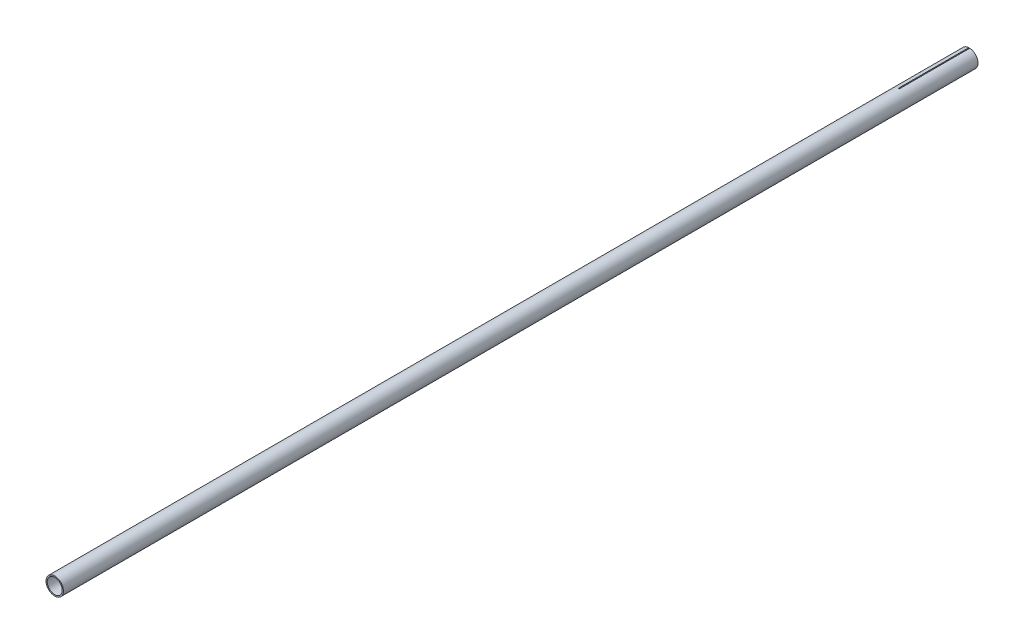
ISO-10303-21;
HEADER;
FILE_DESCRIPTION(('STEP AP214'),'2;1');
FILE_NAME('part.step','',(''),(''),'','','');
FILE_SCHEMA(('AUTOMOTIVE_DESIGN { 1 0 10303 214 1 1 1 1 }'));
ENDSEC;
DATA;
#1=APPLICATION_CONTEXT('core data for automotive mechanical design processes');
#2=APPLICATION_PROTOCOL_DEFINITION('international standard','automotive_design',2000,#1);
#3=PRODUCT_CONTEXT('',#1,'mechanical');
#4=PRODUCT('Part','Part','',(#3));
#5=PRODUCT_RELATED_PRODUCT_CATEGORY('part','',(#4));
#6=PRODUCT_DEFINITION_FORMATION('','',#4);
#7=PRODUCT_DEFINITION_CONTEXT('part definition',#1,'design');
#8=PRODUCT_DEFINITION('design','',#6,#7);
#9=PRODUCT_DEFINITION_SHAPE('','',#8);
#10=(LENGTH_UNIT() NAMED_UNIT(*) SI_UNIT(.MILLI.,.METRE.));
#11=(NAMED_UNIT(*) PLANE_ANGLE_UNIT() SI_UNIT($,.RADIAN.));
#12=(NAMED_UNIT(*) SI_UNIT($,.STERADIAN.) SOLID_ANGLE_UNIT());
#13=UNCERTAINTY_MEASURE_WITH_UNIT(LENGTH_MEASURE(1.E-05),#10,'distance_accuracy_value','');
#14=(GEOMETRIC_REPRESENTATION_CONTEXT(3) GLOBAL_UNCERTAINTY_ASSIGNED_CONTEXT((#13)) GLOBAL_UNIT_ASSIGNED_CONTEXT((#10,
#11,#12)) REPRESENTATION_CONTEXT('',''));
#15=CARTESIAN_POINT('',(0.,0.,0.));
#16=DIRECTION('',(0.,0.,1.));
#17=DIRECTION('',(1.,0.,0.));
#18=AXIS2_PLACEMENT_3D('',#15,#16,#17);
#19=CARTESIAN_POINT('',(0.,0.,0.));
#20=DIRECTION('',(0.,0.,1.));
#21=DIRECTION('',(1.,0.,0.));
#22=AXIS2_PLACEMENT_3D('',#19,#20,#21);
#23=PLANE('',#22);
#24=DIRECTION('',(0.,-1.,0.));
#25=VECTOR('',#24,1.);
#26=CARTESIAN_POINT('',(-1.04,-25.,0.));
#27=LINE('',#26,#25);
#28=CARTESIAN_POINT('',(-1.04,-14.9639032341164,0.));
#29=VERTEX_POINT('',#28);
#30=CARTESIAN_POINT('',(-1.04,-17.4289988237994,0.));
#31=VERTEX_POINT('',#30);
#32=EDGE_CURVE('E120',#29,#31,#27,.T.);
#33=ORIENTED_EDGE('',*,*,#32,.T.);
#34=CARTESIAN_POINT('',(0.,0.,0.));
#35=DIRECTION('',(0.,0.,1.));
#36=DIRECTION('',(1.,0.,0.));
#37=AXIS2_PLACEMENT_3D('',#34,#35,#36);
#38=CIRCLE('',#37,17.46);
#39=CARTESIAN_POINT('',(-1.04,17.4289988237994,0.));
#40=VERTEX_POINT('',#39);
#41=EDGE_CURVE('E126',#40,#31,#38,.T.);
#42=ORIENTED_EDGE('',*,*,#41,.F.);
#43=CARTESIAN_POINT('',(-1.04,14.9639032341164,0.));
#44=VERTEX_POINT('',#43);
#45=EDGE_CURVE('E108',#40,#44,#27,.T.);
#46=ORIENTED_EDGE('',*,*,#45,.T.);
#47=CARTESIAN_POINT('',(0.,0.,0.));
#48=DIRECTION('',(0.,0.,1.));
#49=DIRECTION('',(1.,0.,0.));
#50=AXIS2_PLACEMENT_3D('',#47,#48,#49);
#51=CIRCLE('',#50,15.);
#52=EDGE_CURVE('E169',#44,#29,#51,.T.);
#53=ORIENTED_EDGE('',*,*,#52,.T.);
#54=EDGE_LOOP('',(#33,#42,#46,#53));
#55=FACE_BOUND('',#54,.T.);
#56=ADVANCED_FACE('F43',(#55),#23,.F.);
#57=DIRECTION('',(0.,1.,0.));
#58=VECTOR('',#57,1.);
#59=CARTESIAN_POINT('',(1.04,-25.,0.));
#60=LINE('',#59,#58);
#61=CARTESIAN_POINT('',(1.04,14.9639032341164,0.));
#62=VERTEX_POINT('',#61);
#63=CARTESIAN_POINT('',(1.04,17.4289988237994,0.));
#64=VERTEX_POINT('',#63);
#65=EDGE_CURVE('E119',#62,#64,#60,.T.);
#66=ORIENTED_EDGE('',*,*,#65,.T.);
#67=CARTESIAN_POINT('',(1.04,-17.4289988237994,0.));
#68=VERTEX_POINT('',#67);
#69=EDGE_CURVE('E136',#68,#64,#38,.T.);
#70=ORIENTED_EDGE('',*,*,#69,.F.);
#71=CARTESIAN_POINT('',(1.04,-14.9639032341164,0.));
#72=VERTEX_POINT('',#71);
#73=EDGE_CURVE('E192',#68,#72,#60,.T.);
#74=ORIENTED_EDGE('',*,*,#73,.T.);
#75=EDGE_CURVE('E172',#72,#62,#51,.T.);
#76=ORIENTED_EDGE('',*,*,#75,.T.);
#77=EDGE_LOOP('',(#66,#70,#74,#76));
#78=FACE_BOUND('',#77,.T.);
#79=ADVANCED_FACE('F202',(#78),#23,.F.);
#80=CARTESIAN_POINT('',(0.,0.,1828.8));
#81=DIRECTION('',(0.,0.,-1.));
#82=DIRECTION('',(-1.,0.,0.));
#83=AXIS2_PLACEMENT_3D('',#80,#81,#82);
#84=CYLINDRICAL_SURFACE('',#83,17.46);
#85=CARTESIAN_POINT('',(0.,0.,1828.8));
#86=DIRECTION('',(0.,0.,1.));
#87=DIRECTION('',(1.,0.,0.));
#88=AXIS2_PLACEMENT_3D('',#85,#86,#87);
#89=CIRCLE('',#88,17.46);
#90=CARTESIAN_POINT('',(17.46,0.,1828.8));
#91=VERTEX_POINT('',#90);
#92=EDGE_CURVE('E135',#91,#91,#89,.T.);
#93=ORIENTED_EDGE('',*,*,#92,.F.);
#94=EDGE_LOOP('',(#93));
#95=FACE_BOUND('',#94,.T.);
#96=DIRECTION('',(0.,0.,-1.));
#97=VECTOR('',#96,1.);
#98=CARTESIAN_POINT('',(-1.04,17.4289988237994,1828.8));
#99=LINE('',#98,#97);
#100=CARTESIAN_POINT('',(-1.04,17.4289988237994,141.));
#101=VERTEX_POINT('',#100);
#102=EDGE_CURVE('E112',#40,#101,#99,.F.);
#103=ORIENTED_EDGE('',*,*,#102,.F.);
#104=ORIENTED_EDGE('',*,*,#41,.T.);
#105=DIRECTION('',(0.,0.,-1.));
#106=VECTOR('',#105,1.);
#107=CARTESIAN_POINT('',(-1.04,-17.4289988237994,1828.8));
#108=LINE('',#107,#106);
#109=CARTESIAN_POINT('',(-1.04,-17.4289988237994,141.));
#110=VERTEX_POINT('',#109);
#111=EDGE_CURVE('E130',#110,#31,#108,.T.);
#112=ORIENTED_EDGE('',*,*,#111,.F.);
#113=CARTESIAN_POINT('',(0.,0.,141.));
#114=DIRECTION('',(0.,0.,1.));
#115=DIRECTION('',(1.,0.,0.));
#116=AXIS2_PLACEMENT_3D('',#113,#114,#115);
#117=CIRCLE('',#116,17.46);
#118=CARTESIAN_POINT('',(1.04,-17.4289988237994,141.));
#119=VERTEX_POINT('',#118);
#120=EDGE_CURVE('E185',#110,#119,#117,.T.);
#121=ORIENTED_EDGE('',*,*,#120,.T.);
#122=DIRECTION('',(0.,0.,-1.));
#123=VECTOR('',#122,1.);
#124=CARTESIAN_POINT('',(1.04,-17.4289988237994,1828.8));
#125=LINE('',#124,#123);
#126=EDGE_CURVE('E182',#68,#119,#125,.F.);
#127=ORIENTED_EDGE('',*,*,#126,.F.);
#128=ORIENTED_EDGE('',*,*,#69,.T.);
#129=DIRECTION('',(0.,0.,-1.));
#130=VECTOR('',#129,1.);
#131=CARTESIAN_POINT('',(1.04,17.4289988237994,1828.8));
#132=LINE('',#131,#130);
#133=CARTESIAN_POINT('',(1.04,17.4289988237994,141.));
#134=VERTEX_POINT('',#133);
#135=EDGE_CURVE('E131',#134,#64,#132,.T.);
#136=ORIENTED_EDGE('',*,*,#135,.F.);
#137=EDGE_CURVE('E128',#134,#101,#117,.T.);
#138=ORIENTED_EDGE('',*,*,#137,.T.);
#139=EDGE_LOOP('',(#103,#104,#112,#121,#127,#128,#136,#138));
#140=FACE_BOUND('',#139,.T.);
#141=ADVANCED_FACE('F45',(#95,#140),#84,.T.);
#142=CARTESIAN_POINT('',(0.,0.,1828.8));
#143=DIRECTION('',(0.,0.,-1.));
#144=DIRECTION('',(-1.,0.,0.));
#145=AXIS2_PLACEMENT_3D('',#142,#143,#144);
#146=CYLINDRICAL_SURFACE('',#145,15.);
#147=CARTESIAN_POINT('',(0.,0.,1828.8));
#148=DIRECTION('',(0.,0.,1.));
#149=DIRECTION('',(1.,0.,0.));
#150=AXIS2_PLACEMENT_3D('',#147,#148,#149);
#151=CIRCLE('',#150,15.);
#152=CARTESIAN_POINT('',(15.,0.,1828.8));
#153=VERTEX_POINT('',#152);
#154=EDGE_CURVE('E144',#153,#153,#151,.T.);
#155=ORIENTED_EDGE('',*,*,#154,.T.);
#156=EDGE_LOOP('',(#155));
#157=FACE_BOUND('',#156,.T.);
#158=ORIENTED_EDGE('',*,*,#52,.F.);
#159=DIRECTION('',(0.,0.,-1.));
#160=VECTOR('',#159,1.);
#161=CARTESIAN_POINT('',(-1.04,14.9639032341164,1828.8));
#162=LINE('',#161,#160);
#163=CARTESIAN_POINT('',(-1.04,14.9639032341164,141.));
#164=VERTEX_POINT('',#163);
#165=EDGE_CURVE('E11',#44,#164,#162,.F.);
#166=ORIENTED_EDGE('',*,*,#165,.T.);
#167=CARTESIAN_POINT('',(0.,0.,141.));
#168=DIRECTION('',(0.,0.,1.));
#169=DIRECTION('',(1.,0.,0.));
#170=AXIS2_PLACEMENT_3D('',#167,#168,#169);
#171=CIRCLE('',#170,15.);
#172=CARTESIAN_POINT('',(1.04,14.9639032341164,141.));
#173=VERTEX_POINT('',#172);
#174=EDGE_CURVE('E150',#173,#164,#171,.T.);
#175=ORIENTED_EDGE('',*,*,#174,.F.);
#176=DIRECTION('',(0.,0.,-1.));
#177=VECTOR('',#176,1.);
#178=CARTESIAN_POINT('',(1.04,14.9639032341164,1828.8));
#179=LINE('',#178,#177);
#180=EDGE_CURVE('E52',#173,#62,#179,.T.);
#181=ORIENTED_EDGE('',*,*,#180,.T.);
#182=ORIENTED_EDGE('',*,*,#75,.F.);
#183=DIRECTION('',(0.,0.,-1.));
#184=VECTOR('',#183,1.);
#185=CARTESIAN_POINT('',(1.04,-14.9639032341164,1828.8));
#186=LINE('',#185,#184);
#187=CARTESIAN_POINT('',(1.04,-14.9639032341164,141.));
#188=VERTEX_POINT('',#187);
#189=EDGE_CURVE('E149',#72,#188,#186,.F.);
#190=ORIENTED_EDGE('',*,*,#189,.T.);
#191=CARTESIAN_POINT('',(-1.04,-14.9639032341164,141.));
#192=VERTEX_POINT('',#191);
#193=EDGE_CURVE('E141',#192,#188,#171,.T.);
#194=ORIENTED_EDGE('',*,*,#193,.F.);
#195=DIRECTION('',(0.,0.,-1.));
#196=VECTOR('',#195,1.);
#197=CARTESIAN_POINT('',(-1.04,-14.9639032341164,1828.8));
#198=LINE('',#197,#196);
#199=EDGE_CURVE('E154',#192,#29,#198,.T.);
#200=ORIENTED_EDGE('',*,*,#199,.T.);
#201=EDGE_LOOP('',(#158,#166,#175,#181,#182,#190,#194,#200));
#202=FACE_BOUND('',#201,.T.);
#203=ADVANCED_FACE('F168',(#157,#202),#146,.F.);
#204=CARTESIAN_POINT('',(0.,0.,1828.8));
#205=DIRECTION('',(0.,0.,1.));
#206=DIRECTION('',(1.,0.,0.));
#207=AXIS2_PLACEMENT_3D('',#204,#205,#206);
#208=PLANE('',#207);
#209=ORIENTED_EDGE('',*,*,#92,.T.);
#210=EDGE_LOOP('',(#209));
#211=FACE_BOUND('',#210,.T.);
#212=ORIENTED_EDGE('',*,*,#154,.F.);
#213=EDGE_LOOP('',(#212));
#214=FACE_BOUND('',#213,.T.);
#215=ADVANCED_FACE('F226',(#211,#214),#208,.T.);
#216=CARTESIAN_POINT('',(0.,0.,141.));
#217=DIRECTION('',(0.,0.,1.));
#218=DIRECTION('',(1.,0.,0.));
#219=AXIS2_PLACEMENT_3D('',#216,#217,#218);
#220=PLANE('',#219);
#221=DIRECTION('',(0.,-1.,0.));
#222=VECTOR('',#221,1.);
#223=CARTESIAN_POINT('',(-1.04,-25.,141.));
#224=LINE('',#223,#222);
#225=EDGE_CURVE('E67',#192,#110,#224,.T.);
#226=ORIENTED_EDGE('',*,*,#225,.F.);
#227=ORIENTED_EDGE('',*,*,#193,.T.);
#228=DIRECTION('',(0.,1.,0.));
#229=VECTOR('',#228,1.);
#230=CARTESIAN_POINT('',(1.04,-25.,141.));
#231=LINE('',#230,#229);
#232=EDGE_CURVE('E189',#119,#188,#231,.T.);
#233=ORIENTED_EDGE('',*,*,#232,.F.);
#234=ORIENTED_EDGE('',*,*,#120,.F.);
#235=EDGE_LOOP('',(#226,#227,#233,#234));
#236=FACE_BOUND('',#235,.T.);
#237=ADVANCED_FACE('F210',(#236),#220,.F.);
#238=CARTESIAN_POINT('',(1.04,-25.,141.));
#239=DIRECTION('',(-1.,0.,0.));
#240=DIRECTION('',(0.,0.,1.));
#241=AXIS2_PLACEMENT_3D('',#238,#239,#240);
#242=PLANE('',#241);
#243=ORIENTED_EDGE('',*,*,#126,.T.);
#244=ORIENTED_EDGE('',*,*,#232,.T.);
#245=ORIENTED_EDGE('',*,*,#189,.F.);
#246=ORIENTED_EDGE('',*,*,#73,.F.);
#247=EDGE_LOOP('',(#243,#244,#245,#246));
#248=FACE_BOUND('',#247,.T.);
#249=ADVANCED_FACE('F206',(#248),#242,.T.);
#250=CARTESIAN_POINT('',(-1.04,-25.,141.));
#251=DIRECTION('',(1.,0.,0.));
#252=DIRECTION('',(0.,0.,-1.));
#253=AXIS2_PLACEMENT_3D('',#250,#251,#252);
#254=PLANE('',#253);
#255=ORIENTED_EDGE('',*,*,#111,.T.);
#256=ORIENTED_EDGE('',*,*,#32,.F.);
#257=ORIENTED_EDGE('',*,*,#199,.F.);
#258=ORIENTED_EDGE('',*,*,#225,.T.);
#259=EDGE_LOOP('',(#255,#256,#257,#258));
#260=FACE_BOUND('',#259,.T.);
#261=ADVANCED_FACE('F211',(#260),#254,.T.);
#262=ORIENTED_EDGE('',*,*,#102,.T.);
#263=EDGE_CURVE('E165',#101,#164,#224,.T.);
#264=ORIENTED_EDGE('',*,*,#263,.T.);
#265=ORIENTED_EDGE('',*,*,#165,.F.);
#266=ORIENTED_EDGE('',*,*,#45,.F.);
#267=EDGE_LOOP('',(#262,#264,#265,#266));
#268=FACE_BOUND('',#267,.T.);
#269=ADVANCED_FACE('F110',(#268),#254,.T.);
#270=ORIENTED_EDGE('',*,*,#135,.T.);
#271=ORIENTED_EDGE('',*,*,#65,.F.);
#272=ORIENTED_EDGE('',*,*,#180,.F.);
#273=EDGE_CURVE('E59',#173,#134,#231,.T.);
#274=ORIENTED_EDGE('',*,*,#273,.T.);
#275=EDGE_LOOP('',(#270,#271,#272,#274));
#276=FACE_BOUND('',#275,.T.);
#277=ADVANCED_FACE('F218',(#276),#242,.T.);
#278=ORIENTED_EDGE('',*,*,#273,.F.);
#279=ORIENTED_EDGE('',*,*,#174,.T.);
#280=ORIENTED_EDGE('',*,*,#263,.F.);
#281=ORIENTED_EDGE('',*,*,#137,.F.);
#282=EDGE_LOOP('',(#278,#279,#280,#281));
#283=FACE_BOUND('',#282,.T.);
#284=ADVANCED_FACE('F164',(#283),#220,.F.);
#285=CLOSED_SHELL('',(#56,#79,#141,#203,#215,#237,#249,#261,#269,#277,#284));
#286=MANIFOLD_SOLID_BREP('B2',#285);
#287=ADVANCED_BREP_SHAPE_REPRESENTATION('',(#18,#286),#14);
#288=SHAPE_DEFINITION_REPRESENTATION(#9,#287);
ENDSEC;
END-ISO-10303-21;
